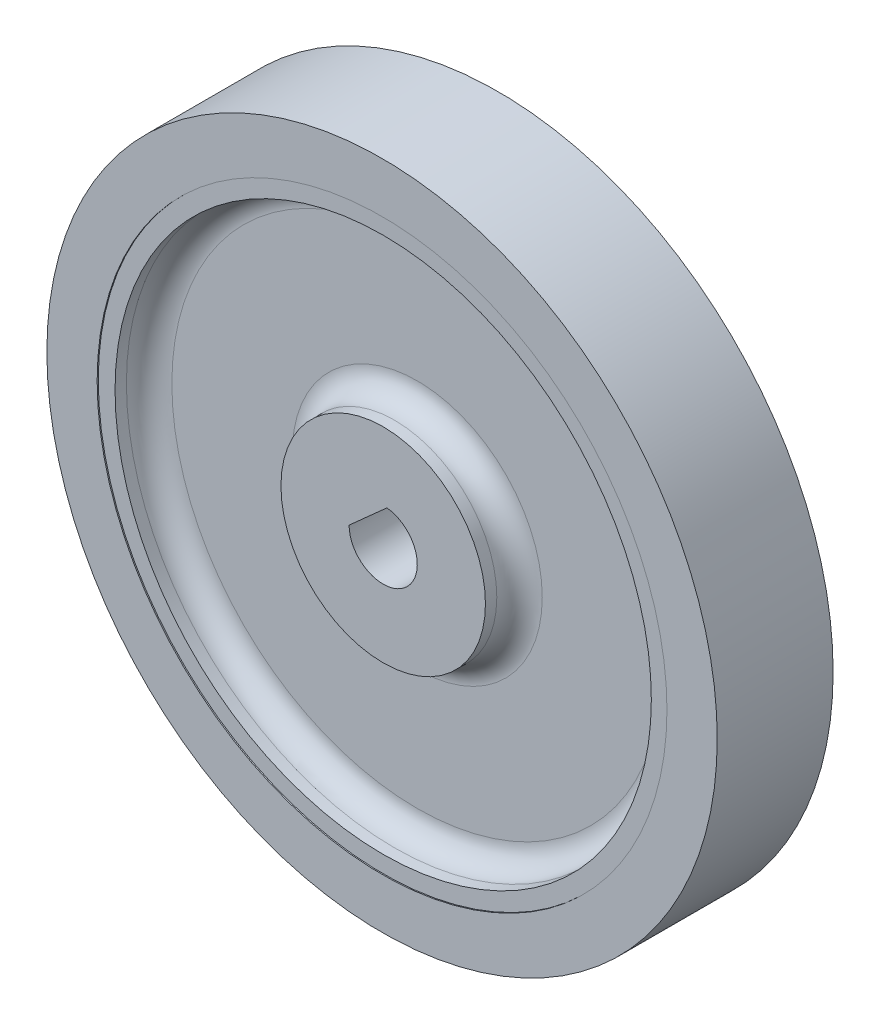
ISO-10303-21;
HEADER;
FILE_DESCRIPTION(('STEP AP214'),'2;1');
FILE_NAME('part.step','',(''),(''),'','','');
FILE_SCHEMA(('AUTOMOTIVE_DESIGN { 1 0 10303 214 1 1 1 1 }'));
ENDSEC;
DATA;
#1=APPLICATION_CONTEXT('core data for automotive mechanical design processes');
#2=APPLICATION_PROTOCOL_DEFINITION('international standard','automotive_design',2000,#1);
#3=PRODUCT_CONTEXT('',#1,'mechanical');
#4=PRODUCT('Part','Part','',(#3));
#5=PRODUCT_RELATED_PRODUCT_CATEGORY('part','',(#4));
#6=PRODUCT_DEFINITION_FORMATION('','',#4);
#7=PRODUCT_DEFINITION_CONTEXT('part definition',#1,'design');
#8=PRODUCT_DEFINITION('design','',#6,#7);
#9=PRODUCT_DEFINITION_SHAPE('','',#8);
#10=(LENGTH_UNIT() NAMED_UNIT(*) SI_UNIT(.MILLI.,.METRE.));
#11=(NAMED_UNIT(*) PLANE_ANGLE_UNIT() SI_UNIT($,.RADIAN.));
#12=(NAMED_UNIT(*) SI_UNIT($,.STERADIAN.) SOLID_ANGLE_UNIT());
#13=UNCERTAINTY_MEASURE_WITH_UNIT(LENGTH_MEASURE(1.E-05),#10,'distance_accuracy_value','');
#14=(GEOMETRIC_REPRESENTATION_CONTEXT(3) GLOBAL_UNCERTAINTY_ASSIGNED_CONTEXT((#13)) GLOBAL_UNIT_ASSIGNED_CONTEXT((#10,
#11,#12)) REPRESENTATION_CONTEXT('',''));
#15=CARTESIAN_POINT('',(0.,0.,0.));
#16=DIRECTION('',(0.,0.,1.));
#17=DIRECTION('',(1.,0.,0.));
#18=AXIS2_PLACEMENT_3D('',#15,#16,#17);
#19=CARTESIAN_POINT('',(0.,0.,5.));
#20=DIRECTION('',(0.,0.,-1.));
#21=DIRECTION('',(-1.,0.,0.));
#22=AXIS2_PLACEMENT_3D('',#19,#20,#21);
#23=CYLINDRICAL_SURFACE('',#22,3.);
#24=DIRECTION('',(0.,0.,-1.));
#25=VECTOR('',#24,1.);
#26=CARTESIAN_POINT('',(0.33015,2.98177815698955,5.));
#27=LINE('',#26,#25);
#28=CARTESIAN_POINT('',(0.33015,2.98177815698955,5.));
#29=VERTEX_POINT('',#28);
#30=CARTESIAN_POINT('',(0.33015,2.98177815698955,-5.));
#31=VERTEX_POINT('',#30);
#32=EDGE_CURVE('E79',#29,#31,#27,.T.);
#33=ORIENTED_EDGE('',*,*,#32,.T.);
#34=CARTESIAN_POINT('',(0.,0.,-5.));
#35=DIRECTION('',(0.,0.,1.));
#36=DIRECTION('',(1.,0.,0.));
#37=AXIS2_PLACEMENT_3D('',#34,#35,#36);
#38=CIRCLE('',#37,3.);
#39=CARTESIAN_POINT('',(-3.,0.,-5.));
#40=VERTEX_POINT('',#39);
#41=EDGE_CURVE('E81',#40,#31,#38,.T.);
#42=ORIENTED_EDGE('',*,*,#41,.F.);
#43=DIRECTION('',(0.,0.,-1.));
#44=VECTOR('',#43,1.);
#45=CARTESIAN_POINT('',(-3.,0.,5.));
#46=LINE('',#45,#44);
#47=CARTESIAN_POINT('',(-3.,0.,5.));
#48=VERTEX_POINT('',#47);
#49=EDGE_CURVE('E74',#48,#40,#46,.T.);
#50=ORIENTED_EDGE('',*,*,#49,.F.);
#51=CARTESIAN_POINT('',(0.,0.,5.));
#52=DIRECTION('',(0.,0.,1.));
#53=DIRECTION('',(1.,0.,0.));
#54=AXIS2_PLACEMENT_3D('',#51,#52,#53);
#55=CIRCLE('',#54,3.);
#56=EDGE_CURVE('E83',#48,#29,#55,.T.);
#57=ORIENTED_EDGE('',*,*,#56,.T.);
#58=EDGE_LOOP('',(#33,#42,#50,#57));
#59=FACE_BOUND('',#58,.T.);
#60=ADVANCED_FACE('F52',(#59),#23,.F.);
#61=CARTESIAN_POINT('',(-1.334925,1.49088907849478,5.));
#62=DIRECTION('',(-0.667064464650906,0.745,0.));
#63=DIRECTION('',(-0.745,-0.667064464650906,0.));
#64=AXIS2_PLACEMENT_3D('',#61,#62,#63);
#65=PLANE('',#64);
#66=ORIENTED_EDGE('',*,*,#49,.T.);
#67=DIRECTION('',(0.745,0.667064464650906,0.));
#68=VECTOR('',#67,1.);
#69=CARTESIAN_POINT('',(-1.334925,1.49088907849478,-5.));
#70=LINE('',#69,#68);
#71=EDGE_CURVE('E91',#40,#31,#70,.T.);
#72=ORIENTED_EDGE('',*,*,#71,.T.);
#73=ORIENTED_EDGE('',*,*,#32,.F.);
#74=DIRECTION('',(0.745,0.667064464650906,0.));
#75=VECTOR('',#74,1.);
#76=CARTESIAN_POINT('',(-1.334925,1.49088907849478,5.));
#77=LINE('',#76,#75);
#78=EDGE_CURVE('E66',#48,#29,#77,.T.);
#79=ORIENTED_EDGE('',*,*,#78,.F.);
#80=EDGE_LOOP('',(#66,#72,#73,#79));
#81=FACE_BOUND('',#80,.T.);
#82=ADVANCED_FACE('F94',(#81),#65,.F.);
#83=CARTESIAN_POINT('',(0.,0.,5.));
#84=DIRECTION('',(0.,0.,-1.));
#85=DIRECTION('',(-1.,0.,0.));
#86=AXIS2_PLACEMENT_3D('',#83,#84,#85);
#87=CYLINDRICAL_SURFACE('',#86,9.);
#88=CARTESIAN_POINT('',(0.,0.,4.));
#89=DIRECTION('',(0.,0.,1.));
#90=DIRECTION('',(1.,0.,0.));
#91=AXIS2_PLACEMENT_3D('',#88,#89,#90);
#92=CIRCLE('',#91,9.);
#93=CARTESIAN_POINT('',(9.,0.,4.));
#94=VERTEX_POINT('',#93);
#95=EDGE_CURVE('E127',#94,#94,#92,.T.);
#96=ORIENTED_EDGE('',*,*,#95,.T.);
#97=EDGE_LOOP('',(#96));
#98=FACE_BOUND('',#97,.T.);
#99=CARTESIAN_POINT('',(0.,0.,5.));
#100=DIRECTION('',(0.,0.,1.));
#101=DIRECTION('',(1.,0.,0.));
#102=AXIS2_PLACEMENT_3D('',#99,#100,#101);
#103=CIRCLE('',#102,9.);
#104=CARTESIAN_POINT('',(9.,0.,5.));
#105=VERTEX_POINT('',#104);
#106=EDGE_CURVE('E86',#105,#105,#103,.T.);
#107=ORIENTED_EDGE('',*,*,#106,.F.);
#108=EDGE_LOOP('',(#107));
#109=FACE_BOUND('',#108,.T.);
#110=ADVANCED_FACE('F183',(#98,#109),#87,.T.);
#111=CARTESIAN_POINT('',(0.,0.,5.));
#112=DIRECTION('',(0.,0.,1.));
#113=DIRECTION('',(1.,0.,0.));
#114=AXIS2_PLACEMENT_3D('',#111,#112,#113);
#115=PLANE('',#114);
#116=ORIENTED_EDGE('',*,*,#56,.F.);
#117=ORIENTED_EDGE('',*,*,#78,.T.);
#118=EDGE_LOOP('',(#116,#117));
#119=FACE_BOUND('',#118,.T.);
#120=ORIENTED_EDGE('',*,*,#106,.T.);
#121=EDGE_LOOP('',(#120));
#122=FACE_BOUND('',#121,.T.);
#123=ADVANCED_FACE('F207',(#119,#122),#115,.T.);
#124=CARTESIAN_POINT('',(0.,0.,2.));
#125=DIRECTION('',(0.,0.,1.));
#126=DIRECTION('',(1.,0.,0.));
#127=AXIS2_PLACEMENT_3D('',#124,#125,#126);
#128=PLANE('',#127);
#129=CARTESIAN_POINT('',(0.,0.,2.));
#130=DIRECTION('',(0.,0.,1.));
#131=DIRECTION('',(1.,0.,0.));
#132=AXIS2_PLACEMENT_3D('',#129,#130,#131);
#133=CIRCLE('',#132,21.6);
#134=CARTESIAN_POINT('',(21.6,0.,2.));
#135=VERTEX_POINT('',#134);
#136=EDGE_CURVE('E124',#135,#135,#133,.T.);
#137=ORIENTED_EDGE('',*,*,#136,.T.);
#138=EDGE_LOOP('',(#137));
#139=FACE_BOUND('',#138,.T.);
#140=CARTESIAN_POINT('',(0.,0.,2.));
#141=DIRECTION('',(0.,0.,1.));
#142=DIRECTION('',(1.,0.,0.));
#143=AXIS2_PLACEMENT_3D('',#140,#141,#142);
#144=CIRCLE('',#143,11.);
#145=CARTESIAN_POINT('',(11.,0.,2.));
#146=VERTEX_POINT('',#145);
#147=EDGE_CURVE('E121',#146,#146,#144,.F.);
#148=ORIENTED_EDGE('',*,*,#147,.T.);
#149=EDGE_LOOP('',(#148));
#150=FACE_BOUND('',#149,.T.);
#151=ADVANCED_FACE('F211',(#139,#150),#128,.T.);
#152=CARTESIAN_POINT('',(0.,0.,5.));
#153=DIRECTION('',(0.,0.,-1.));
#154=DIRECTION('',(-1.,0.,0.));
#155=AXIS2_PLACEMENT_3D('',#152,#153,#154);
#156=CYLINDRICAL_SURFACE('',#155,23.6);
#157=CARTESIAN_POINT('',(0.,0.,4.));
#158=DIRECTION('',(0.,0.,1.));
#159=DIRECTION('',(1.,0.,0.));
#160=AXIS2_PLACEMENT_3D('',#157,#158,#159);
#161=CIRCLE('',#160,23.6);
#162=CARTESIAN_POINT('',(23.6,0.,4.));
#163=VERTEX_POINT('',#162);
#164=EDGE_CURVE('E118',#163,#163,#161,.F.);
#165=ORIENTED_EDGE('',*,*,#164,.T.);
#166=EDGE_LOOP('',(#165));
#167=FACE_BOUND('',#166,.T.);
#168=CARTESIAN_POINT('',(0.,0.,5.));
#169=DIRECTION('',(0.,0.,1.));
#170=DIRECTION('',(1.,0.,0.));
#171=AXIS2_PLACEMENT_3D('',#168,#169,#170);
#172=CIRCLE('',#171,23.6);
#173=CARTESIAN_POINT('',(23.6,0.,5.));
#174=VERTEX_POINT('',#173);
#175=EDGE_CURVE('E110',#174,#174,#172,.T.);
#176=ORIENTED_EDGE('',*,*,#175,.T.);
#177=EDGE_LOOP('',(#176));
#178=FACE_BOUND('',#177,.T.);
#179=ADVANCED_FACE('F216',(#167,#178),#156,.F.);
#180=CARTESIAN_POINT('',(0.,0.,5.));
#181=DIRECTION('',(0.,0.,1.));
#182=DIRECTION('',(1.,0.,0.));
#183=AXIS2_PLACEMENT_3D('',#180,#181,#182);
#184=PLANE('',#183);
#185=ORIENTED_EDGE('',*,*,#175,.F.);
#186=EDGE_LOOP('',(#185));
#187=FACE_BOUND('',#186,.T.);
#188=CARTESIAN_POINT('',(0.,0.,5.));
#189=DIRECTION('',(0.,0.,1.));
#190=DIRECTION('',(1.,0.,0.));
#191=AXIS2_PLACEMENT_3D('',#188,#189,#190);
#192=CIRCLE('',#191,25.075);
#193=CARTESIAN_POINT('',(25.075,0.,5.));
#194=VERTEX_POINT('',#193);
#195=EDGE_CURVE('E107',#194,#194,#192,.F.);
#196=ORIENTED_EDGE('',*,*,#195,.F.);
#197=EDGE_LOOP('',(#196));
#198=FACE_BOUND('',#197,.T.);
#199=ADVANCED_FACE('F222',(#187,#198),#184,.T.);
#200=CARTESIAN_POINT('',(0.,0.,5.1));
#201=DIRECTION('',(0.,0.,-1.));
#202=DIRECTION('',(-1.,0.,0.));
#203=AXIS2_PLACEMENT_3D('',#200,#201,#202);
#204=CYLINDRICAL_SURFACE('',#203,25.075);
#205=ORIENTED_EDGE('',*,*,#195,.T.);
#206=EDGE_LOOP('',(#205));
#207=FACE_BOUND('',#206,.T.);
#208=CARTESIAN_POINT('',(0.,0.,5.1));
#209=DIRECTION('',(0.,0.,1.));
#210=DIRECTION('',(1.,0.,0.));
#211=AXIS2_PLACEMENT_3D('',#208,#209,#210);
#212=CIRCLE('',#211,25.075);
#213=CARTESIAN_POINT('',(25.075,0.,5.1));
#214=VERTEX_POINT('',#213);
#215=EDGE_CURVE('E98',#214,#214,#212,.T.);
#216=ORIENTED_EDGE('',*,*,#215,.T.);
#217=EDGE_LOOP('',(#216));
#218=FACE_BOUND('',#217,.T.);
#219=ADVANCED_FACE('F226',(#207,#218),#204,.F.);
#220=CARTESIAN_POINT('',(0.,0.,5.1));
#221=DIRECTION('',(0.,0.,-1.));
#222=DIRECTION('',(-1.,0.,0.));
#223=AXIS2_PLACEMENT_3D('',#220,#221,#222);
#224=CYLINDRICAL_SURFACE('',#223,29.5);
#225=CARTESIAN_POINT('',(0.,0.,5.1));
#226=DIRECTION('',(0.,0.,1.));
#227=DIRECTION('',(1.,0.,0.));
#228=AXIS2_PLACEMENT_3D('',#225,#226,#227);
#229=CIRCLE('',#228,29.5);
#230=CARTESIAN_POINT('',(29.5,0.,5.1));
#231=VERTEX_POINT('',#230);
#232=EDGE_CURVE('E104',#231,#231,#229,.T.);
#233=ORIENTED_EDGE('',*,*,#232,.F.);
#234=EDGE_LOOP('',(#233));
#235=FACE_BOUND('',#234,.T.);
#236=CARTESIAN_POINT('',(0.,0.,-5.1));
#237=DIRECTION('',(0.,0.,1.));
#238=DIRECTION('',(1.,0.,0.));
#239=AXIS2_PLACEMENT_3D('',#236,#237,#238);
#240=CIRCLE('',#239,29.5);
#241=CARTESIAN_POINT('',(29.5,0.,-5.1));
#242=VERTEX_POINT('',#241);
#243=EDGE_CURVE('E156',#242,#242,#240,.T.);
#244=ORIENTED_EDGE('',*,*,#243,.T.);
#245=EDGE_LOOP('',(#244));
#246=FACE_BOUND('',#245,.T.);
#247=ADVANCED_FACE('F230',(#235,#246),#224,.T.);
#248=CARTESIAN_POINT('',(0.,0.,5.1));
#249=DIRECTION('',(0.,0.,1.));
#250=DIRECTION('',(1.,0.,0.));
#251=AXIS2_PLACEMENT_3D('',#248,#249,#250);
#252=PLANE('',#251);
#253=ORIENTED_EDGE('',*,*,#215,.F.);
#254=EDGE_LOOP('',(#253));
#255=FACE_BOUND('',#254,.T.);
#256=ORIENTED_EDGE('',*,*,#232,.T.);
#257=EDGE_LOOP('',(#256));
#258=FACE_BOUND('',#257,.T.);
#259=ADVANCED_FACE('F191',(#255,#258),#252,.T.);
#260=CARTESIAN_POINT('',(0.,0.,4.));
#261=DIRECTION('',(0.,0.,1.));
#262=DIRECTION('',(1.,0.,0.));
#263=AXIS2_PLACEMENT_3D('',#260,#261,#262);
#264=TOROIDAL_SURFACE('',#263,21.6,2.);
#265=ORIENTED_EDGE('',*,*,#136,.F.);
#266=EDGE_LOOP('',(#265));
#267=FACE_BOUND('',#266,.T.);
#268=ORIENTED_EDGE('',*,*,#164,.F.);
#269=EDGE_LOOP('',(#268));
#270=FACE_BOUND('',#269,.T.);
#271=ADVANCED_FACE('F187',(#267,#270),#264,.F.);
#272=CARTESIAN_POINT('',(0.,0.,4.));
#273=DIRECTION('',(0.,0.,1.));
#274=DIRECTION('',(1.,0.,0.));
#275=AXIS2_PLACEMENT_3D('',#272,#273,#274);
#276=TOROIDAL_SURFACE('',#275,11.,2.);
#277=ORIENTED_EDGE('',*,*,#147,.F.);
#278=EDGE_LOOP('',(#277));
#279=FACE_BOUND('',#278,.T.);
#280=ORIENTED_EDGE('',*,*,#95,.F.);
#281=EDGE_LOOP('',(#280));
#282=FACE_BOUND('',#281,.T.);
#283=ADVANCED_FACE('F190',(#279,#282),#276,.F.);
#284=CARTESIAN_POINT('',(0.,0.,-5.));
#285=DIRECTION('',(0.,0.,1.));
#286=DIRECTION('',(1.,0.,0.));
#287=AXIS2_PLACEMENT_3D('',#284,#285,#286);
#288=CYLINDRICAL_SURFACE('',#287,9.);
#289=CARTESIAN_POINT('',(0.,0.,-4.));
#290=DIRECTION('',(0.,0.,-1.));
#291=DIRECTION('',(-1.,0.,0.));
#292=AXIS2_PLACEMENT_3D('',#289,#290,#291);
#293=CIRCLE('',#292,9.);
#294=CARTESIAN_POINT('',(-9.,0.,-4.));
#295=VERTEX_POINT('',#294);
#296=EDGE_CURVE('E12',#295,#295,#293,.T.);
#297=ORIENTED_EDGE('',*,*,#296,.T.);
#298=EDGE_LOOP('',(#297));
#299=FACE_BOUND('',#298,.T.);
#300=CARTESIAN_POINT('',(0.,0.,-5.));
#301=DIRECTION('',(0.,0.,1.));
#302=DIRECTION('',(1.,0.,0.));
#303=AXIS2_PLACEMENT_3D('',#300,#301,#302);
#304=CIRCLE('',#303,9.);
#305=CARTESIAN_POINT('',(9.,0.,-5.));
#306=VERTEX_POINT('',#305);
#307=EDGE_CURVE('E95',#306,#306,#304,.T.);
#308=ORIENTED_EDGE('',*,*,#307,.T.);
#309=EDGE_LOOP('',(#308));
#310=FACE_BOUND('',#309,.T.);
#311=ADVANCED_FACE('F194',(#299,#310),#288,.T.);
#312=CARTESIAN_POINT('',(0.,0.,-5.));
#313=DIRECTION('',(0.,0.,-1.));
#314=DIRECTION('',(1.,0.,0.));
#315=AXIS2_PLACEMENT_3D('',#312,#313,#314);
#316=PLANE('',#315);
#317=ORIENTED_EDGE('',*,*,#41,.T.);
#318=ORIENTED_EDGE('',*,*,#71,.F.);
#319=EDGE_LOOP('',(#317,#318));
#320=FACE_BOUND('',#319,.T.);
#321=ORIENTED_EDGE('',*,*,#307,.F.);
#322=EDGE_LOOP('',(#321));
#323=FACE_BOUND('',#322,.T.);
#324=ADVANCED_FACE('F89',(#320,#323),#316,.T.);
#325=CARTESIAN_POINT('',(0.,0.,-5.));
#326=DIRECTION('',(0.,0.,1.));
#327=DIRECTION('',(1.,0.,0.));
#328=AXIS2_PLACEMENT_3D('',#325,#326,#327);
#329=CYLINDRICAL_SURFACE('',#328,23.6);
#330=CARTESIAN_POINT('',(0.,0.,-4.));
#331=DIRECTION('',(0.,0.,-1.));
#332=DIRECTION('',(-1.,0.,0.));
#333=AXIS2_PLACEMENT_3D('',#330,#331,#332);
#334=CIRCLE('',#333,23.6);
#335=CARTESIAN_POINT('',(-23.6,0.,-4.));
#336=VERTEX_POINT('',#335);
#337=EDGE_CURVE('E130',#336,#336,#334,.F.);
#338=ORIENTED_EDGE('',*,*,#337,.T.);
#339=EDGE_LOOP('',(#338));
#340=FACE_BOUND('',#339,.T.);
#341=CARTESIAN_POINT('',(0.,0.,-5.));
#342=DIRECTION('',(0.,0.,1.));
#343=DIRECTION('',(1.,0.,0.));
#344=AXIS2_PLACEMENT_3D('',#341,#342,#343);
#345=CIRCLE('',#344,23.6);
#346=CARTESIAN_POINT('',(23.6,0.,-5.));
#347=VERTEX_POINT('',#346);
#348=EDGE_CURVE('E154',#347,#347,#345,.T.);
#349=ORIENTED_EDGE('',*,*,#348,.F.);
#350=EDGE_LOOP('',(#349));
#351=FACE_BOUND('',#350,.T.);
#352=ADVANCED_FACE('F147',(#340,#351),#329,.F.);
#353=CARTESIAN_POINT('',(0.,0.,-5.));
#354=DIRECTION('',(0.,0.,-1.));
#355=DIRECTION('',(1.,0.,0.));
#356=AXIS2_PLACEMENT_3D('',#353,#354,#355);
#357=PLANE('',#356);
#358=ORIENTED_EDGE('',*,*,#348,.T.);
#359=EDGE_LOOP('',(#358));
#360=FACE_BOUND('',#359,.T.);
#361=CARTESIAN_POINT('',(0.,0.,-5.));
#362=DIRECTION('',(0.,0.,1.));
#363=DIRECTION('',(1.,0.,0.));
#364=AXIS2_PLACEMENT_3D('',#361,#362,#363);
#365=CIRCLE('',#364,25.075);
#366=CARTESIAN_POINT('',(25.075,0.,-5.));
#367=VERTEX_POINT('',#366);
#368=EDGE_CURVE('E92',#367,#367,#365,.T.);
#369=ORIENTED_EDGE('',*,*,#368,.F.);
#370=EDGE_LOOP('',(#369));
#371=FACE_BOUND('',#370,.T.);
#372=ADVANCED_FACE('F150',(#360,#371),#357,.T.);
#373=CARTESIAN_POINT('',(0.,0.,-2.));
#374=DIRECTION('',(0.,0.,-1.));
#375=DIRECTION('',(1.,0.,0.));
#376=AXIS2_PLACEMENT_3D('',#373,#374,#375);
#377=PLANE('',#376);
#378=CARTESIAN_POINT('',(0.,0.,-2.));
#379=DIRECTION('',(0.,0.,-1.));
#380=DIRECTION('',(-1.,0.,0.));
#381=AXIS2_PLACEMENT_3D('',#378,#379,#380);
#382=CIRCLE('',#381,21.6);
#383=CARTESIAN_POINT('',(-21.6,0.,-2.));
#384=VERTEX_POINT('',#383);
#385=EDGE_CURVE('E60',#384,#384,#382,.T.);
#386=ORIENTED_EDGE('',*,*,#385,.T.);
#387=EDGE_LOOP('',(#386));
#388=FACE_BOUND('',#387,.T.);
#389=CARTESIAN_POINT('',(0.,0.,-2.));
#390=DIRECTION('',(0.,0.,-1.));
#391=DIRECTION('',(-1.,0.,0.));
#392=AXIS2_PLACEMENT_3D('',#389,#390,#391);
#393=CIRCLE('',#392,11.);
#394=CARTESIAN_POINT('',(-11.,0.,-2.));
#395=VERTEX_POINT('',#394);
#396=EDGE_CURVE('E133',#395,#395,#393,.F.);
#397=ORIENTED_EDGE('',*,*,#396,.T.);
#398=EDGE_LOOP('',(#397));
#399=FACE_BOUND('',#398,.T.);
#400=ADVANCED_FACE('F138',(#388,#399),#377,.T.);
#401=CARTESIAN_POINT('',(0.,0.,-5.1));
#402=DIRECTION('',(0.,0.,1.));
#403=DIRECTION('',(1.,0.,0.));
#404=AXIS2_PLACEMENT_3D('',#401,#402,#403);
#405=CYLINDRICAL_SURFACE('',#404,25.075);
#406=ORIENTED_EDGE('',*,*,#368,.T.);
#407=EDGE_LOOP('',(#406));
#408=FACE_BOUND('',#407,.T.);
#409=CARTESIAN_POINT('',(0.,0.,-5.1));
#410=DIRECTION('',(0.,0.,1.));
#411=DIRECTION('',(1.,0.,0.));
#412=AXIS2_PLACEMENT_3D('',#409,#410,#411);
#413=CIRCLE('',#412,25.075);
#414=CARTESIAN_POINT('',(25.075,0.,-5.1));
#415=VERTEX_POINT('',#414);
#416=EDGE_CURVE('E160',#415,#415,#413,.T.);
#417=ORIENTED_EDGE('',*,*,#416,.F.);
#418=EDGE_LOOP('',(#417));
#419=FACE_BOUND('',#418,.T.);
#420=ADVANCED_FACE('F168',(#408,#419),#405,.F.);
#421=CARTESIAN_POINT('',(0.,0.,-5.1));
#422=DIRECTION('',(0.,0.,-1.));
#423=DIRECTION('',(1.,0.,0.));
#424=AXIS2_PLACEMENT_3D('',#421,#422,#423);
#425=PLANE('',#424);
#426=ORIENTED_EDGE('',*,*,#416,.T.);
#427=EDGE_LOOP('',(#426));
#428=FACE_BOUND('',#427,.T.);
#429=ORIENTED_EDGE('',*,*,#243,.F.);
#430=EDGE_LOOP('',(#429));
#431=FACE_BOUND('',#430,.T.);
#432=ADVANCED_FACE('F144',(#428,#431),#425,.T.);
#433=CARTESIAN_POINT('',(0.,0.,-4.));
#434=DIRECTION('',(0.,0.,-1.));
#435=DIRECTION('',(-1.,0.,0.));
#436=AXIS2_PLACEMENT_3D('',#433,#434,#435);
#437=TOROIDAL_SURFACE('',#436,21.6,2.);
#438=ORIENTED_EDGE('',*,*,#385,.F.);
#439=EDGE_LOOP('',(#438));
#440=FACE_BOUND('',#439,.T.);
#441=ORIENTED_EDGE('',*,*,#337,.F.);
#442=EDGE_LOOP('',(#441));
#443=FACE_BOUND('',#442,.T.);
#444=ADVANCED_FACE('F141',(#440,#443),#437,.F.);
#445=CARTESIAN_POINT('',(0.,0.,-4.));
#446=DIRECTION('',(0.,0.,-1.));
#447=DIRECTION('',(-1.,0.,0.));
#448=AXIS2_PLACEMENT_3D('',#445,#446,#447);
#449=TOROIDAL_SURFACE('',#448,11.,2.);
#450=ORIENTED_EDGE('',*,*,#296,.F.);
#451=EDGE_LOOP('',(#450));
#452=FACE_BOUND('',#451,.T.);
#453=ORIENTED_EDGE('',*,*,#396,.F.);
#454=EDGE_LOOP('',(#453));
#455=FACE_BOUND('',#454,.T.);
#456=ADVANCED_FACE('F54',(#452,#455),#449,.F.);
#457=CLOSED_SHELL('',(#60,#82,#110,#123,#151,#179,#199,#219,#247,#259,#271,#283,#311,#324,#352,
#372,#400,#420,#432,#444,#456));
#458=MANIFOLD_SOLID_BREP('B2',#457);
#459=ADVANCED_BREP_SHAPE_REPRESENTATION('',(#18,#458),#14);
#460=SHAPE_DEFINITION_REPRESENTATION(#9,#459);
ENDSEC;
END-ISO-10303-21;
